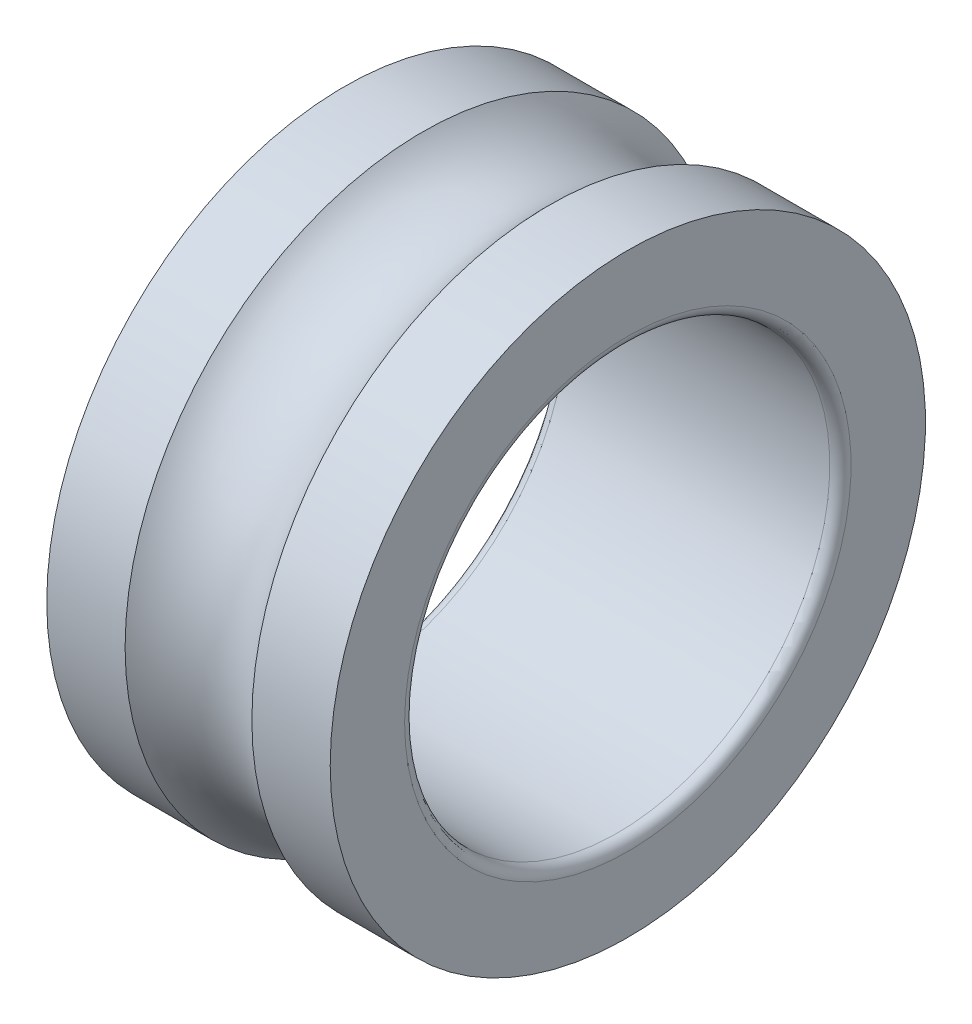
ISO-10303-21;
HEADER;
FILE_DESCRIPTION(('STEP AP214'),'2;1');
FILE_NAME('part.step','',(''),(''),'','','');
FILE_SCHEMA(('AUTOMOTIVE_DESIGN { 1 0 10303 214 1 1 1 1 }'));
ENDSEC;
DATA;
#1=APPLICATION_CONTEXT('core data for automotive mechanical design processes');
#2=APPLICATION_PROTOCOL_DEFINITION('international standard','automotive_design',2000,#1);
#3=PRODUCT_CONTEXT('',#1,'mechanical');
#4=PRODUCT('Part','Part','',(#3));
#5=PRODUCT_RELATED_PRODUCT_CATEGORY('part','',(#4));
#6=PRODUCT_DEFINITION_FORMATION('','',#4);
#7=PRODUCT_DEFINITION_CONTEXT('part definition',#1,'design');
#8=PRODUCT_DEFINITION('design','',#6,#7);
#9=PRODUCT_DEFINITION_SHAPE('','',#8);
#10=(LENGTH_UNIT() NAMED_UNIT(*) SI_UNIT(.MILLI.,.METRE.));
#11=(NAMED_UNIT(*) PLANE_ANGLE_UNIT() SI_UNIT($,.RADIAN.));
#12=(NAMED_UNIT(*) SI_UNIT($,.STERADIAN.) SOLID_ANGLE_UNIT());
#13=UNCERTAINTY_MEASURE_WITH_UNIT(LENGTH_MEASURE(1.E-05),#10,'distance_accuracy_value','');
#14=(GEOMETRIC_REPRESENTATION_CONTEXT(3) GLOBAL_UNCERTAINTY_ASSIGNED_CONTEXT((#13)) GLOBAL_UNIT_ASSIGNED_CONTEXT((#10,
#11,#12)) REPRESENTATION_CONTEXT('',''));
#15=CARTESIAN_POINT('',(0.,0.,0.));
#16=DIRECTION('',(0.,0.,1.));
#17=DIRECTION('',(1.,0.,0.));
#18=AXIS2_PLACEMENT_3D('',#15,#16,#17);
#19=CARTESIAN_POINT('',(0.300000000000002,0.,0.));
#20=DIRECTION('',(-1.,0.,0.));
#21=DIRECTION('',(0.,0.,1.));
#22=AXIS2_PLACEMENT_3D('',#19,#20,#21);
#23=TOROIDAL_SURFACE('',#22,6.3,0.300000000000001);
#24=CARTESIAN_POINT('',(0.300000000000001,0.,0.));
#25=DIRECTION('',(-1.,0.,0.));
#26=DIRECTION('',(0.,0.,1.));
#27=AXIS2_PLACEMENT_3D('',#24,#25,#26);
#28=CIRCLE('',#27,6.);
#29=CARTESIAN_POINT('',(0.300000000000001,0.,6.));
#30=VERTEX_POINT('',#29);
#31=EDGE_CURVE('E10',#30,#30,#28,.T.);
#32=ORIENTED_EDGE('',*,*,#31,.F.);
#33=EDGE_LOOP('',(#32));
#34=FACE_BOUND('',#33,.T.);
#35=CARTESIAN_POINT('',(0.,0.,0.));
#36=DIRECTION('',(-1.,0.,0.));
#37=DIRECTION('',(0.,0.,1.));
#38=AXIS2_PLACEMENT_3D('',#35,#36,#37);
#39=CIRCLE('',#38,6.3);
#40=CARTESIAN_POINT('',(0.,0.,6.3));
#41=VERTEX_POINT('',#40);
#42=EDGE_CURVE('E57',#41,#41,#39,.T.);
#43=ORIENTED_EDGE('',*,*,#42,.T.);
#44=EDGE_LOOP('',(#43));
#45=FACE_BOUND('',#44,.T.);
#46=ADVANCED_FACE('F29',(#34,#45),#23,.T.);
#47=CARTESIAN_POINT('',(0.,0.,0.));
#48=DIRECTION('',(-1.,0.,0.));
#49=DIRECTION('',(0.,0.,1.));
#50=AXIS2_PLACEMENT_3D('',#47,#48,#49);
#51=CYLINDRICAL_SURFACE('',#50,6.);
#52=CARTESIAN_POINT('',(7.7,0.,0.));
#53=DIRECTION('',(-1.,0.,0.));
#54=DIRECTION('',(0.,0.,1.));
#55=AXIS2_PLACEMENT_3D('',#52,#53,#54);
#56=CIRCLE('',#55,6.);
#57=CARTESIAN_POINT('',(7.7,0.,6.));
#58=VERTEX_POINT('',#57);
#59=EDGE_CURVE('E35',#58,#58,#56,.T.);
#60=ORIENTED_EDGE('',*,*,#59,.F.);
#61=EDGE_LOOP('',(#60));
#62=FACE_BOUND('',#61,.T.);
#63=ORIENTED_EDGE('',*,*,#31,.T.);
#64=EDGE_LOOP('',(#63));
#65=FACE_BOUND('',#64,.T.);
#66=ADVANCED_FACE('F94',(#62,#65),#51,.F.);
#67=CARTESIAN_POINT('',(7.7,0.,0.));
#68=DIRECTION('',(-1.,0.,0.));
#69=DIRECTION('',(0.,0.,1.));
#70=AXIS2_PLACEMENT_3D('',#67,#68,#69);
#71=TOROIDAL_SURFACE('',#70,6.3,0.300000000000001);
#72=CARTESIAN_POINT('',(8.,0.,0.));
#73=DIRECTION('',(-1.,0.,0.));
#74=DIRECTION('',(0.,0.,1.));
#75=AXIS2_PLACEMENT_3D('',#72,#73,#74);
#76=CIRCLE('',#75,6.3);
#77=CARTESIAN_POINT('',(8.,0.,6.3));
#78=VERTEX_POINT('',#77);
#79=EDGE_CURVE('E39',#78,#78,#76,.T.);
#80=ORIENTED_EDGE('',*,*,#79,.F.);
#81=EDGE_LOOP('',(#80));
#82=FACE_BOUND('',#81,.T.);
#83=ORIENTED_EDGE('',*,*,#59,.T.);
#84=EDGE_LOOP('',(#83));
#85=FACE_BOUND('',#84,.T.);
#86=ADVANCED_FACE('F89',(#82,#85),#71,.T.);
#87=CARTESIAN_POINT('',(8.,0.,-8.4));
#88=DIRECTION('',(-1.,0.,0.));
#89=DIRECTION('',(0.,0.,1.));
#90=AXIS2_PLACEMENT_3D('',#87,#88,#89);
#91=PLANE('',#90);
#92=CARTESIAN_POINT('',(8.,0.,0.));
#93=DIRECTION('',(-1.,0.,0.));
#94=DIRECTION('',(0.,0.,1.));
#95=AXIS2_PLACEMENT_3D('',#92,#93,#94);
#96=CIRCLE('',#95,8.4);
#97=CARTESIAN_POINT('',(8.,0.,8.4));
#98=VERTEX_POINT('',#97);
#99=EDGE_CURVE('E43',#98,#98,#96,.T.);
#100=ORIENTED_EDGE('',*,*,#99,.F.);
#101=EDGE_LOOP('',(#100));
#102=FACE_BOUND('',#101,.T.);
#103=ORIENTED_EDGE('',*,*,#79,.T.);
#104=EDGE_LOOP('',(#103));
#105=FACE_BOUND('',#104,.T.);
#106=ADVANCED_FACE('F83',(#102,#105),#91,.F.);
#107=CARTESIAN_POINT('',(0.,0.,0.));
#108=DIRECTION('',(-1.,0.,0.));
#109=DIRECTION('',(0.,0.,1.));
#110=AXIS2_PLACEMENT_3D('',#107,#108,#109);
#111=CYLINDRICAL_SURFACE('',#110,8.4);
#112=CARTESIAN_POINT('',(5.78885438199983,0.,0.));
#113=DIRECTION('',(-1.,0.,0.));
#114=DIRECTION('',(0.,0.,1.));
#115=AXIS2_PLACEMENT_3D('',#112,#113,#114);
#116=CIRCLE('',#115,8.4);
#117=CARTESIAN_POINT('',(5.78885438199983,0.,8.4));
#118=VERTEX_POINT('',#117);
#119=EDGE_CURVE('E48',#118,#118,#116,.T.);
#120=ORIENTED_EDGE('',*,*,#119,.F.);
#121=EDGE_LOOP('',(#120));
#122=FACE_BOUND('',#121,.T.);
#123=ORIENTED_EDGE('',*,*,#99,.T.);
#124=EDGE_LOOP('',(#123));
#125=FACE_BOUND('',#124,.T.);
#126=ADVANCED_FACE('F77',(#122,#125),#111,.T.);
#127=CARTESIAN_POINT('',(4.,0.,0.));
#128=DIRECTION('',(-1.,0.,0.));
#129=DIRECTION('',(0.,0.,1.));
#130=AXIS2_PLACEMENT_3D('',#127,#128,#129);
#131=TOROIDAL_SURFACE('',#130,10.,2.4);
#132=CARTESIAN_POINT('',(2.21114561800017,0.,0.));
#133=DIRECTION('',(-1.,0.,0.));
#134=DIRECTION('',(0.,0.,1.));
#135=AXIS2_PLACEMENT_3D('',#132,#133,#134);
#136=CIRCLE('',#135,8.4);
#137=CARTESIAN_POINT('',(2.21114561800017,0.,8.4));
#138=VERTEX_POINT('',#137);
#139=EDGE_CURVE('E51',#138,#138,#136,.T.);
#140=ORIENTED_EDGE('',*,*,#139,.F.);
#141=EDGE_LOOP('',(#140));
#142=FACE_BOUND('',#141,.T.);
#143=ORIENTED_EDGE('',*,*,#119,.T.);
#144=EDGE_LOOP('',(#143));
#145=FACE_BOUND('',#144,.T.);
#146=ADVANCED_FACE('F71',(#142,#145),#131,.F.);
#147=CARTESIAN_POINT('',(0.,0.,0.));
#148=DIRECTION('',(-1.,0.,0.));
#149=DIRECTION('',(0.,0.,1.));
#150=AXIS2_PLACEMENT_3D('',#147,#148,#149);
#151=CYLINDRICAL_SURFACE('',#150,8.4);
#152=CARTESIAN_POINT('',(0.,0.,0.));
#153=DIRECTION('',(-1.,0.,0.));
#154=DIRECTION('',(0.,0.,1.));
#155=AXIS2_PLACEMENT_3D('',#152,#153,#154);
#156=CIRCLE('',#155,8.4);
#157=CARTESIAN_POINT('',(0.,0.,8.4));
#158=VERTEX_POINT('',#157);
#159=EDGE_CURVE('E54',#158,#158,#156,.T.);
#160=ORIENTED_EDGE('',*,*,#159,.F.);
#161=EDGE_LOOP('',(#160));
#162=FACE_BOUND('',#161,.T.);
#163=ORIENTED_EDGE('',*,*,#139,.T.);
#164=EDGE_LOOP('',(#163));
#165=FACE_BOUND('',#164,.T.);
#166=ADVANCED_FACE('F65',(#162,#165),#151,.T.);
#167=CARTESIAN_POINT('',(0.,0.,-8.4));
#168=DIRECTION('',(1.,0.,0.));
#169=DIRECTION('',(0.,0.,-1.));
#170=AXIS2_PLACEMENT_3D('',#167,#168,#169);
#171=PLANE('',#170);
#172=ORIENTED_EDGE('',*,*,#42,.F.);
#173=EDGE_LOOP('',(#172));
#174=FACE_BOUND('',#173,.T.);
#175=ORIENTED_EDGE('',*,*,#159,.T.);
#176=EDGE_LOOP('',(#175));
#177=FACE_BOUND('',#176,.T.);
#178=ADVANCED_FACE('F62',(#174,#177),#171,.F.);
#179=CLOSED_SHELL('',(#46,#66,#86,#106,#126,#146,#166,#178));
#180=MANIFOLD_SOLID_BREP('B2',#179);
#181=ADVANCED_BREP_SHAPE_REPRESENTATION('',(#18,#180),#14);
#182=SHAPE_DEFINITION_REPRESENTATION(#9,#181);
ENDSEC;
END-ISO-10303-21;
